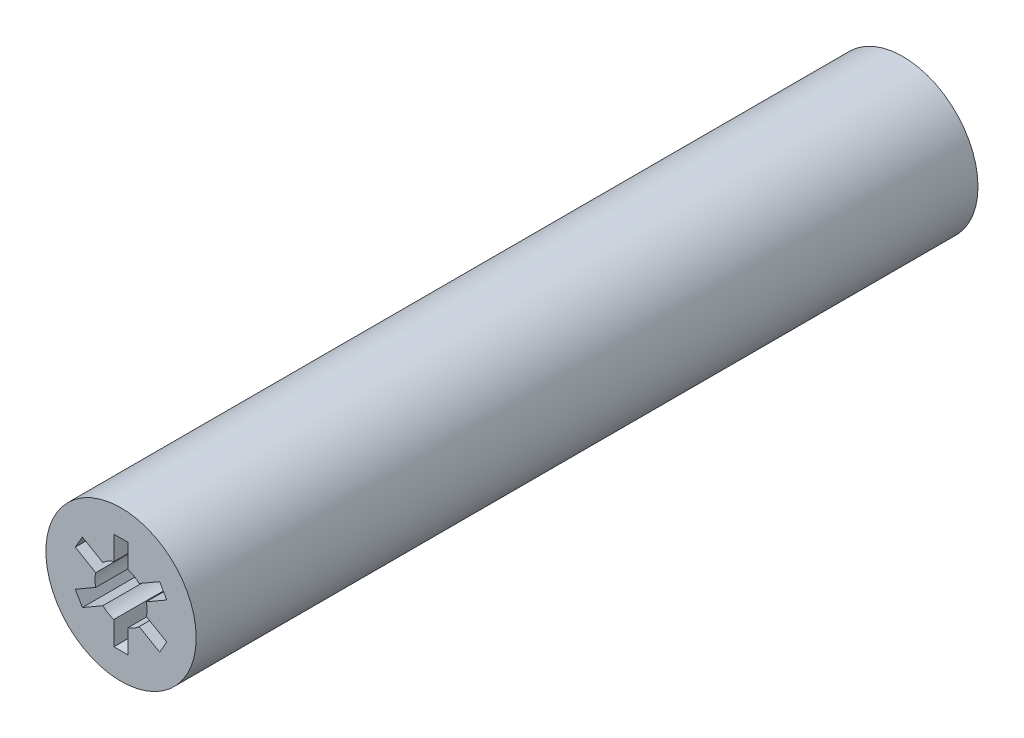
ISO-10303-21;
HEADER;
FILE_DESCRIPTION(('STEP AP214'),'2;1');
FILE_NAME('part.step','',(''),(''),'','','');
FILE_SCHEMA(('AUTOMOTIVE_DESIGN { 1 0 10303 214 1 1 1 1 }'));
ENDSEC;
DATA;
#1=APPLICATION_CONTEXT('core data for automotive mechanical design processes');
#2=APPLICATION_PROTOCOL_DEFINITION('international standard','automotive_design',2000,#1);
#3=PRODUCT_CONTEXT('',#1,'mechanical');
#4=PRODUCT('Part','Part','',(#3));
#5=PRODUCT_RELATED_PRODUCT_CATEGORY('part','',(#4));
#6=PRODUCT_DEFINITION_FORMATION('','',#4);
#7=PRODUCT_DEFINITION_CONTEXT('part definition',#1,'design');
#8=PRODUCT_DEFINITION('design','',#6,#7);
#9=PRODUCT_DEFINITION_SHAPE('','',#8);
#10=(LENGTH_UNIT() NAMED_UNIT(*) SI_UNIT(.MILLI.,.METRE.));
#11=(NAMED_UNIT(*) PLANE_ANGLE_UNIT() SI_UNIT($,.RADIAN.));
#12=(NAMED_UNIT(*) SI_UNIT($,.STERADIAN.) SOLID_ANGLE_UNIT());
#13=UNCERTAINTY_MEASURE_WITH_UNIT(LENGTH_MEASURE(1.E-05),#10,'distance_accuracy_value','');
#14=(GEOMETRIC_REPRESENTATION_CONTEXT(3) GLOBAL_UNCERTAINTY_ASSIGNED_CONTEXT((#13)) GLOBAL_UNIT_ASSIGNED_CONTEXT((#10,
#11,#12)) REPRESENTATION_CONTEXT('',''));
#15=CARTESIAN_POINT('',(0.,0.,0.));
#16=DIRECTION('',(0.,0.,1.));
#17=DIRECTION('',(1.,0.,0.));
#18=AXIS2_PLACEMENT_3D('',#15,#16,#17);
#19=CARTESIAN_POINT('',(0.,0.,82.55));
#20=DIRECTION('',(0.,0.,1.));
#21=DIRECTION('',(1.,0.,0.));
#22=AXIS2_PLACEMENT_3D('',#19,#20,#21);
#23=PLANE('',#22);
#24=CARTESIAN_POINT('',(0.,0.,82.55));
#25=DIRECTION('',(0.,0.,1.));
#26=DIRECTION('',(1.,0.,0.));
#27=AXIS2_PLACEMENT_3D('',#24,#25,#26);
#28=CIRCLE('',#27,15.875);
#29=CARTESIAN_POINT('',(15.875,0.,82.55));
#30=VERTEX_POINT('',#29);
#31=EDGE_CURVE('E11',#30,#30,#28,.T.);
#32=ORIENTED_EDGE('',*,*,#31,.T.);
#33=EDGE_LOOP('',(#32));
#34=FACE_BOUND('',#33,.T.);
#35=DIRECTION('',(-1.,0.,0.));
#36=VECTOR('',#35,1.);
#37=CARTESIAN_POINT('',(-1.5,10.2915026221292,82.55));
#38=LINE('',#37,#36);
#39=CARTESIAN_POINT('',(1.5,10.2915026221292,82.55));
#40=VERTEX_POINT('',#39);
#41=CARTESIAN_POINT('',(-1.5,10.2915026221292,82.55));
#42=VERTEX_POINT('',#41);
#43=EDGE_CURVE('E216',#40,#42,#38,.T.);
#44=ORIENTED_EDGE('',*,*,#43,.F.);
#45=DIRECTION('',(0.,1.,0.));
#46=VECTOR('',#45,1.);
#47=CARTESIAN_POINT('',(1.5,10.2915026221292,82.55));
#48=LINE('',#47,#46);
#49=CARTESIAN_POINT('',(1.5,5.29150262212918,82.55));
#50=VERTEX_POINT('',#49);
#51=EDGE_CURVE('E207',#50,#40,#48,.T.);
#52=ORIENTED_EDGE('',*,*,#51,.F.);
#53=CARTESIAN_POINT('',(0.,0.,82.55));
#54=DIRECTION('',(0.,0.,1.));
#55=DIRECTION('',(1.,0.,0.));
#56=AXIS2_PLACEMENT_3D('',#53,#54,#55);
#57=CIRCLE('',#56,5.5);
#58=CARTESIAN_POINT('',(3.83257569495584,3.94478941674125,82.55));
#59=VERTEX_POINT('',#58);
#60=EDGE_CURVE('E295',#59,#50,#57,.T.);
#61=ORIENTED_EDGE('',*,*,#60,.F.);
#62=DIRECTION('',(-0.866025403784439,-0.5,0.));
#63=VECTOR('',#62,1.);
#64=CARTESIAN_POINT('',(3.83257569495584,3.94478941674125,82.55));
#65=LINE('',#64,#63);
#66=CARTESIAN_POINT('',(8.16270271387803,6.44478941674125,82.55));
#67=VERTEX_POINT('',#66);
#68=EDGE_CURVE('E292',#67,#59,#65,.T.);
#69=ORIENTED_EDGE('',*,*,#68,.F.);
#70=DIRECTION('',(-0.500000000000001,0.866025403784438,0.));
#71=VECTOR('',#70,1.);
#72=CARTESIAN_POINT('',(8.16270271387803,6.44478941674125,82.55));
#73=LINE('',#72,#71);
#74=CARTESIAN_POINT('',(9.66270271387804,3.84671320538793,82.55));
#75=VERTEX_POINT('',#74);
#76=EDGE_CURVE('E289',#75,#67,#73,.T.);
#77=ORIENTED_EDGE('',*,*,#76,.F.);
#78=DIRECTION('',(0.866025403784438,0.5,0.));
#79=VECTOR('',#78,1.);
#80=CARTESIAN_POINT('',(9.66270271387804,3.84671320538793,82.55));
#81=LINE('',#80,#79);
#82=CARTESIAN_POINT('',(5.33257569495584,1.34671320538793,82.55));
#83=VERTEX_POINT('',#82);
#84=EDGE_CURVE('E286',#83,#75,#81,.T.);
#85=ORIENTED_EDGE('',*,*,#84,.F.);
#86=CARTESIAN_POINT('',(0.,0.,82.55));
#87=DIRECTION('',(0.,0.,1.));
#88=DIRECTION('',(1.,0.,0.));
#89=AXIS2_PLACEMENT_3D('',#86,#87,#88);
#90=CIRCLE('',#89,5.5);
#91=CARTESIAN_POINT('',(5.33257569495584,-1.34671320538793,82.55));
#92=VERTEX_POINT('',#91);
#93=EDGE_CURVE('E283',#92,#83,#90,.T.);
#94=ORIENTED_EDGE('',*,*,#93,.F.);
#95=DIRECTION('',(-0.866025403784439,0.5,0.));
#96=VECTOR('',#95,1.);
#97=CARTESIAN_POINT('',(5.33257569495584,-1.34671320538793,82.55));
#98=LINE('',#97,#96);
#99=CARTESIAN_POINT('',(9.66270271387804,-3.84671320538793,82.55));
#100=VERTEX_POINT('',#99);
#101=EDGE_CURVE('E280',#100,#92,#98,.T.);
#102=ORIENTED_EDGE('',*,*,#101,.F.);
#103=DIRECTION('',(0.499999999999999,0.866025403784439,0.));
#104=VECTOR('',#103,1.);
#105=CARTESIAN_POINT('',(9.66270271387804,-3.84671320538793,82.55));
#106=LINE('',#105,#104);
#107=CARTESIAN_POINT('',(8.16270271387804,-6.44478941674125,82.55));
#108=VERTEX_POINT('',#107);
#109=EDGE_CURVE('E277',#108,#100,#106,.T.);
#110=ORIENTED_EDGE('',*,*,#109,.F.);
#111=DIRECTION('',(0.866025403784439,-0.5,0.));
#112=VECTOR('',#111,1.);
#113=CARTESIAN_POINT('',(8.16270271387804,-6.44478941674125,82.55));
#114=LINE('',#113,#112);
#115=CARTESIAN_POINT('',(3.83257569495584,-3.94478941674125,82.55));
#116=VERTEX_POINT('',#115);
#117=EDGE_CURVE('E274',#116,#108,#114,.T.);
#118=ORIENTED_EDGE('',*,*,#117,.F.);
#119=CARTESIAN_POINT('',(0.,0.,82.55));
#120=DIRECTION('',(0.,0.,1.));
#121=DIRECTION('',(1.,0.,0.));
#122=AXIS2_PLACEMENT_3D('',#119,#120,#121);
#123=CIRCLE('',#122,5.5);
#124=CARTESIAN_POINT('',(1.5,-5.29150262212918,82.55));
#125=VERTEX_POINT('',#124);
#126=EDGE_CURVE('E271',#125,#116,#123,.T.);
#127=ORIENTED_EDGE('',*,*,#126,.F.);
#128=DIRECTION('',(0.,1.,0.));
#129=VECTOR('',#128,1.);
#130=CARTESIAN_POINT('',(1.5,-5.29150262212918,82.55));
#131=LINE('',#130,#129);
#132=CARTESIAN_POINT('',(1.5,-10.2915026221292,82.55));
#133=VERTEX_POINT('',#132);
#134=EDGE_CURVE('E268',#133,#125,#131,.T.);
#135=ORIENTED_EDGE('',*,*,#134,.F.);
#136=DIRECTION('',(1.,0.,0.));
#137=VECTOR('',#136,1.);
#138=CARTESIAN_POINT('',(1.5,-10.2915026221292,82.55));
#139=LINE('',#138,#137);
#140=CARTESIAN_POINT('',(-1.5,-10.2915026221292,82.55));
#141=VERTEX_POINT('',#140);
#142=EDGE_CURVE('E265',#141,#133,#139,.T.);
#143=ORIENTED_EDGE('',*,*,#142,.F.);
#144=DIRECTION('',(0.,-1.,0.));
#145=VECTOR('',#144,1.);
#146=CARTESIAN_POINT('',(-1.5,-10.2915026221292,82.55));
#147=LINE('',#146,#145);
#148=CARTESIAN_POINT('',(-1.5,-5.29150262212918,82.55));
#149=VERTEX_POINT('',#148);
#150=EDGE_CURVE('E262',#149,#141,#147,.T.);
#151=ORIENTED_EDGE('',*,*,#150,.F.);
#152=CARTESIAN_POINT('',(0.,0.,82.55));
#153=DIRECTION('',(0.,0.,1.));
#154=DIRECTION('',(1.,0.,0.));
#155=AXIS2_PLACEMENT_3D('',#152,#153,#154);
#156=CIRCLE('',#155,5.5);
#157=CARTESIAN_POINT('',(-3.83257569495584,-3.94478941674125,82.55));
#158=VERTEX_POINT('',#157);
#159=EDGE_CURVE('E259',#158,#149,#156,.T.);
#160=ORIENTED_EDGE('',*,*,#159,.F.);
#161=DIRECTION('',(0.866025403784438,0.5,0.));
#162=VECTOR('',#161,1.);
#163=CARTESIAN_POINT('',(-3.83257569495584,-3.94478941674125,82.55));
#164=LINE('',#163,#162);
#165=CARTESIAN_POINT('',(-8.16270271387803,-6.44478941674125,82.55));
#166=VERTEX_POINT('',#165);
#167=EDGE_CURVE('E256',#166,#158,#164,.T.);
#168=ORIENTED_EDGE('',*,*,#167,.F.);
#169=DIRECTION('',(0.500000000000001,-0.866025403784438,0.));
#170=VECTOR('',#169,1.);
#171=CARTESIAN_POINT('',(-8.16270271387803,-6.44478941674125,82.55));
#172=LINE('',#171,#170);
#173=CARTESIAN_POINT('',(-9.66270271387803,-3.84671320538794,82.55));
#174=VERTEX_POINT('',#173);
#175=EDGE_CURVE('E253',#174,#166,#172,.T.);
#176=ORIENTED_EDGE('',*,*,#175,.F.);
#177=DIRECTION('',(-0.866025403784438,-0.500000000000001,0.));
#178=VECTOR('',#177,1.);
#179=CARTESIAN_POINT('',(-9.66270271387803,-3.84671320538794,82.55));
#180=LINE('',#179,#178);
#181=CARTESIAN_POINT('',(-5.33257569495584,-1.34671320538793,82.55));
#182=VERTEX_POINT('',#181);
#183=EDGE_CURVE('E250',#182,#174,#180,.T.);
#184=ORIENTED_EDGE('',*,*,#183,.F.);
#185=CARTESIAN_POINT('',(0.,0.,82.55));
#186=DIRECTION('',(0.,0.,1.));
#187=DIRECTION('',(1.,0.,0.));
#188=AXIS2_PLACEMENT_3D('',#185,#186,#187);
#189=CIRCLE('',#188,5.5);
#190=CARTESIAN_POINT('',(-5.33257569495584,1.34671320538793,82.55));
#191=VERTEX_POINT('',#190);
#192=EDGE_CURVE('E247',#191,#182,#189,.T.);
#193=ORIENTED_EDGE('',*,*,#192,.F.);
#194=DIRECTION('',(0.866025403784439,-0.5,0.));
#195=VECTOR('',#194,1.);
#196=CARTESIAN_POINT('',(-5.33257569495584,1.34671320538793,82.55));
#197=LINE('',#196,#195);
#198=CARTESIAN_POINT('',(-9.66270271387804,3.84671320538793,82.55));
#199=VERTEX_POINT('',#198);
#200=EDGE_CURVE('E244',#199,#191,#197,.T.);
#201=ORIENTED_EDGE('',*,*,#200,.F.);
#202=DIRECTION('',(-0.499999999999999,-0.866025403784439,0.));
#203=VECTOR('',#202,1.);
#204=CARTESIAN_POINT('',(-9.66270271387804,3.84671320538793,82.55));
#205=LINE('',#204,#203);
#206=CARTESIAN_POINT('',(-8.16270271387804,6.44478941674124,82.55));
#207=VERTEX_POINT('',#206);
#208=EDGE_CURVE('E241',#207,#199,#205,.T.);
#209=ORIENTED_EDGE('',*,*,#208,.F.);
#210=DIRECTION('',(-0.866025403784439,0.499999999999999,0.));
#211=VECTOR('',#210,1.);
#212=CARTESIAN_POINT('',(-8.16270271387804,6.44478941674124,82.55));
#213=LINE('',#212,#211);
#214=CARTESIAN_POINT('',(-3.83257569495585,3.94478941674125,82.55));
#215=VERTEX_POINT('',#214);
#216=EDGE_CURVE('E238',#215,#207,#213,.T.);
#217=ORIENTED_EDGE('',*,*,#216,.F.);
#218=CARTESIAN_POINT('',(0.,0.,82.55));
#219=DIRECTION('',(0.,0.,1.));
#220=DIRECTION('',(1.,0.,0.));
#221=AXIS2_PLACEMENT_3D('',#218,#219,#220);
#222=CIRCLE('',#221,5.5);
#223=CARTESIAN_POINT('',(-1.5,5.29150262212918,82.55));
#224=VERTEX_POINT('',#223);
#225=EDGE_CURVE('E233',#224,#215,#222,.T.);
#226=ORIENTED_EDGE('',*,*,#225,.F.);
#227=DIRECTION('',(0.,-1.,0.));
#228=VECTOR('',#227,1.);
#229=CARTESIAN_POINT('',(-1.5,5.29150262212918,82.55));
#230=LINE('',#229,#228);
#231=EDGE_CURVE('E229',#42,#224,#230,.T.);
#232=ORIENTED_EDGE('',*,*,#231,.F.);
#233=EDGE_LOOP('',(#44,#52,#61,#69,#77,#85,#94,#102,#110,#118,#127,#135,#143,#151,#160,#168,
#176,#184,#193,#201,#209,#217,#226,#232));
#234=FACE_BOUND('',#233,.T.);
#235=ADVANCED_FACE('F45',(#34,#234),#23,.T.);
#236=CARTESIAN_POINT('',(0.,0.,-82.55));
#237=DIRECTION('',(0.,0.,1.));
#238=DIRECTION('',(1.,0.,0.));
#239=AXIS2_PLACEMENT_3D('',#236,#237,#238);
#240=PLANE('',#239);
#241=CARTESIAN_POINT('',(0.,0.,-82.55));
#242=DIRECTION('',(0.,0.,1.));
#243=DIRECTION('',(1.,0.,0.));
#244=AXIS2_PLACEMENT_3D('',#241,#242,#243);
#245=CIRCLE('',#244,15.875);
#246=CARTESIAN_POINT('',(15.875,0.,-82.55));
#247=VERTEX_POINT('',#246);
#248=EDGE_CURVE('E49',#247,#247,#245,.T.);
#249=ORIENTED_EDGE('',*,*,#248,.F.);
#250=EDGE_LOOP('',(#249));
#251=FACE_BOUND('',#250,.T.);
#252=DIRECTION('',(0.,1.,0.));
#253=VECTOR('',#252,1.);
#254=CARTESIAN_POINT('',(1.5,10.2915026221292,-82.55));
#255=LINE('',#254,#253);
#256=CARTESIAN_POINT('',(1.5,5.29150262212918,-82.55));
#257=VERTEX_POINT('',#256);
#258=CARTESIAN_POINT('',(1.5,10.2915026221292,-82.55));
#259=VERTEX_POINT('',#258);
#260=EDGE_CURVE('E69',#257,#259,#255,.T.);
#261=ORIENTED_EDGE('',*,*,#260,.T.);
#262=DIRECTION('',(-1.,0.,0.));
#263=VECTOR('',#262,1.);
#264=CARTESIAN_POINT('',(-1.5,10.2915026221292,-82.55));
#265=LINE('',#264,#263);
#266=CARTESIAN_POINT('',(-1.5,10.2915026221292,-82.55));
#267=VERTEX_POINT('',#266);
#268=EDGE_CURVE('E223',#259,#267,#265,.T.);
#269=ORIENTED_EDGE('',*,*,#268,.T.);
#270=DIRECTION('',(0.,-1.,0.));
#271=VECTOR('',#270,1.);
#272=CARTESIAN_POINT('',(-1.5,5.29150262212918,-82.55));
#273=LINE('',#272,#271);
#274=CARTESIAN_POINT('',(-1.5,5.29150262212918,-82.55));
#275=VERTEX_POINT('',#274);
#276=EDGE_CURVE('E302',#267,#275,#273,.T.);
#277=ORIENTED_EDGE('',*,*,#276,.T.);
#278=CARTESIAN_POINT('',(0.,0.,-82.55));
#279=DIRECTION('',(0.,0.,1.));
#280=DIRECTION('',(1.,0.,0.));
#281=AXIS2_PLACEMENT_3D('',#278,#279,#280);
#282=CIRCLE('',#281,5.5);
#283=CARTESIAN_POINT('',(-3.83257569495585,3.94478941674125,-82.55));
#284=VERTEX_POINT('',#283);
#285=EDGE_CURVE('E306',#275,#284,#282,.T.);
#286=ORIENTED_EDGE('',*,*,#285,.T.);
#287=DIRECTION('',(-0.866025403784439,0.499999999999999,0.));
#288=VECTOR('',#287,1.);
#289=CARTESIAN_POINT('',(-8.16270271387804,6.44478941674124,-82.55));
#290=LINE('',#289,#288);
#291=CARTESIAN_POINT('',(-8.16270271387804,6.44478941674124,-82.55));
#292=VERTEX_POINT('',#291);
#293=EDGE_CURVE('E310',#284,#292,#290,.T.);
#294=ORIENTED_EDGE('',*,*,#293,.T.);
#295=DIRECTION('',(-0.499999999999999,-0.866025403784439,0.));
#296=VECTOR('',#295,1.);
#297=CARTESIAN_POINT('',(-9.66270271387804,3.84671320538793,-82.55));
#298=LINE('',#297,#296);
#299=CARTESIAN_POINT('',(-9.66270271387804,3.84671320538793,-82.55));
#300=VERTEX_POINT('',#299);
#301=EDGE_CURVE('E314',#292,#300,#298,.T.);
#302=ORIENTED_EDGE('',*,*,#301,.T.);
#303=DIRECTION('',(0.866025403784439,-0.5,0.));
#304=VECTOR('',#303,1.);
#305=CARTESIAN_POINT('',(-5.33257569495584,1.34671320538793,-82.55));
#306=LINE('',#305,#304);
#307=CARTESIAN_POINT('',(-5.33257569495584,1.34671320538793,-82.55));
#308=VERTEX_POINT('',#307);
#309=EDGE_CURVE('E318',#300,#308,#306,.T.);
#310=ORIENTED_EDGE('',*,*,#309,.T.);
#311=CARTESIAN_POINT('',(0.,0.,-82.55));
#312=DIRECTION('',(0.,0.,1.));
#313=DIRECTION('',(1.,0.,0.));
#314=AXIS2_PLACEMENT_3D('',#311,#312,#313);
#315=CIRCLE('',#314,5.5);
#316=CARTESIAN_POINT('',(-5.33257569495584,-1.34671320538793,-82.55));
#317=VERTEX_POINT('',#316);
#318=EDGE_CURVE('E322',#308,#317,#315,.T.);
#319=ORIENTED_EDGE('',*,*,#318,.T.);
#320=DIRECTION('',(-0.866025403784438,-0.500000000000001,0.));
#321=VECTOR('',#320,1.);
#322=CARTESIAN_POINT('',(-9.66270271387803,-3.84671320538794,-82.55));
#323=LINE('',#322,#321);
#324=CARTESIAN_POINT('',(-9.66270271387803,-3.84671320538794,-82.55));
#325=VERTEX_POINT('',#324);
#326=EDGE_CURVE('E326',#317,#325,#323,.T.);
#327=ORIENTED_EDGE('',*,*,#326,.T.);
#328=DIRECTION('',(0.500000000000001,-0.866025403784438,0.));
#329=VECTOR('',#328,1.);
#330=CARTESIAN_POINT('',(-8.16270271387803,-6.44478941674125,-82.55));
#331=LINE('',#330,#329);
#332=CARTESIAN_POINT('',(-8.16270271387803,-6.44478941674125,-82.55));
#333=VERTEX_POINT('',#332);
#334=EDGE_CURVE('E330',#325,#333,#331,.T.);
#335=ORIENTED_EDGE('',*,*,#334,.T.);
#336=DIRECTION('',(0.866025403784438,0.5,0.));
#337=VECTOR('',#336,1.);
#338=CARTESIAN_POINT('',(-3.83257569495584,-3.94478941674125,-82.55));
#339=LINE('',#338,#337);
#340=CARTESIAN_POINT('',(-3.83257569495584,-3.94478941674125,-82.55));
#341=VERTEX_POINT('',#340);
#342=EDGE_CURVE('E334',#333,#341,#339,.T.);
#343=ORIENTED_EDGE('',*,*,#342,.T.);
#344=CARTESIAN_POINT('',(0.,0.,-82.55));
#345=DIRECTION('',(0.,0.,1.));
#346=DIRECTION('',(1.,0.,0.));
#347=AXIS2_PLACEMENT_3D('',#344,#345,#346);
#348=CIRCLE('',#347,5.5);
#349=CARTESIAN_POINT('',(-1.5,-5.29150262212918,-82.55));
#350=VERTEX_POINT('',#349);
#351=EDGE_CURVE('E338',#341,#350,#348,.T.);
#352=ORIENTED_EDGE('',*,*,#351,.T.);
#353=DIRECTION('',(0.,-1.,0.));
#354=VECTOR('',#353,1.);
#355=CARTESIAN_POINT('',(-1.5,-10.2915026221292,-82.55));
#356=LINE('',#355,#354);
#357=CARTESIAN_POINT('',(-1.5,-10.2915026221292,-82.55));
#358=VERTEX_POINT('',#357);
#359=EDGE_CURVE('E342',#350,#358,#356,.T.);
#360=ORIENTED_EDGE('',*,*,#359,.T.);
#361=DIRECTION('',(1.,0.,0.));
#362=VECTOR('',#361,1.);
#363=CARTESIAN_POINT('',(1.5,-10.2915026221292,-82.55));
#364=LINE('',#363,#362);
#365=CARTESIAN_POINT('',(1.5,-10.2915026221292,-82.55));
#366=VERTEX_POINT('',#365);
#367=EDGE_CURVE('E346',#358,#366,#364,.T.);
#368=ORIENTED_EDGE('',*,*,#367,.T.);
#369=DIRECTION('',(0.,1.,0.));
#370=VECTOR('',#369,1.);
#371=CARTESIAN_POINT('',(1.5,-5.29150262212918,-82.55));
#372=LINE('',#371,#370);
#373=CARTESIAN_POINT('',(1.5,-5.29150262212918,-82.55));
#374=VERTEX_POINT('',#373);
#375=EDGE_CURVE('E350',#366,#374,#372,.T.);
#376=ORIENTED_EDGE('',*,*,#375,.T.);
#377=CARTESIAN_POINT('',(0.,0.,-82.55));
#378=DIRECTION('',(0.,0.,1.));
#379=DIRECTION('',(1.,0.,0.));
#380=AXIS2_PLACEMENT_3D('',#377,#378,#379);
#381=CIRCLE('',#380,5.5);
#382=CARTESIAN_POINT('',(3.83257569495584,-3.94478941674125,-82.55));
#383=VERTEX_POINT('',#382);
#384=EDGE_CURVE('E354',#374,#383,#381,.T.);
#385=ORIENTED_EDGE('',*,*,#384,.T.);
#386=DIRECTION('',(0.866025403784439,-0.5,0.));
#387=VECTOR('',#386,1.);
#388=CARTESIAN_POINT('',(8.16270271387804,-6.44478941674125,-82.55));
#389=LINE('',#388,#387);
#390=CARTESIAN_POINT('',(8.16270271387804,-6.44478941674125,-82.55));
#391=VERTEX_POINT('',#390);
#392=EDGE_CURVE('E358',#383,#391,#389,.T.);
#393=ORIENTED_EDGE('',*,*,#392,.T.);
#394=DIRECTION('',(0.499999999999999,0.866025403784439,0.));
#395=VECTOR('',#394,1.);
#396=CARTESIAN_POINT('',(9.66270271387804,-3.84671320538793,-82.55));
#397=LINE('',#396,#395);
#398=CARTESIAN_POINT('',(9.66270271387804,-3.84671320538793,-82.55));
#399=VERTEX_POINT('',#398);
#400=EDGE_CURVE('E362',#391,#399,#397,.T.);
#401=ORIENTED_EDGE('',*,*,#400,.T.);
#402=DIRECTION('',(-0.866025403784439,0.5,0.));
#403=VECTOR('',#402,1.);
#404=CARTESIAN_POINT('',(5.33257569495584,-1.34671320538793,-82.55));
#405=LINE('',#404,#403);
#406=CARTESIAN_POINT('',(5.33257569495584,-1.34671320538793,-82.55));
#407=VERTEX_POINT('',#406);
#408=EDGE_CURVE('E366',#399,#407,#405,.T.);
#409=ORIENTED_EDGE('',*,*,#408,.T.);
#410=CARTESIAN_POINT('',(0.,0.,-82.55));
#411=DIRECTION('',(0.,0.,1.));
#412=DIRECTION('',(1.,0.,0.));
#413=AXIS2_PLACEMENT_3D('',#410,#411,#412);
#414=CIRCLE('',#413,5.5);
#415=CARTESIAN_POINT('',(5.33257569495584,1.34671320538793,-82.55));
#416=VERTEX_POINT('',#415);
#417=EDGE_CURVE('E370',#407,#416,#414,.T.);
#418=ORIENTED_EDGE('',*,*,#417,.T.);
#419=DIRECTION('',(0.866025403784438,0.5,0.));
#420=VECTOR('',#419,1.);
#421=CARTESIAN_POINT('',(9.66270271387804,3.84671320538793,-82.55));
#422=LINE('',#421,#420);
#423=CARTESIAN_POINT('',(9.66270271387804,3.84671320538793,-82.55));
#424=VERTEX_POINT('',#423);
#425=EDGE_CURVE('E374',#416,#424,#422,.T.);
#426=ORIENTED_EDGE('',*,*,#425,.T.);
#427=DIRECTION('',(-0.500000000000001,0.866025403784438,0.));
#428=VECTOR('',#427,1.);
#429=CARTESIAN_POINT('',(8.16270271387803,6.44478941674125,-82.55));
#430=LINE('',#429,#428);
#431=CARTESIAN_POINT('',(8.16270271387803,6.44478941674125,-82.55));
#432=VERTEX_POINT('',#431);
#433=EDGE_CURVE('E378',#424,#432,#430,.T.);
#434=ORIENTED_EDGE('',*,*,#433,.T.);
#435=DIRECTION('',(-0.866025403784439,-0.5,0.));
#436=VECTOR('',#435,1.);
#437=CARTESIAN_POINT('',(3.83257569495584,3.94478941674125,-82.55));
#438=LINE('',#437,#436);
#439=CARTESIAN_POINT('',(3.83257569495584,3.94478941674125,-82.55));
#440=VERTEX_POINT('',#439);
#441=EDGE_CURVE('E382',#432,#440,#438,.T.);
#442=ORIENTED_EDGE('',*,*,#441,.T.);
#443=CARTESIAN_POINT('',(0.,0.,-82.55));
#444=DIRECTION('',(0.,0.,1.));
#445=DIRECTION('',(1.,0.,0.));
#446=AXIS2_PLACEMENT_3D('',#443,#444,#445);
#447=CIRCLE('',#446,5.5);
#448=EDGE_CURVE('E217',#440,#257,#447,.T.);
#449=ORIENTED_EDGE('',*,*,#448,.T.);
#450=EDGE_LOOP('',(#261,#269,#277,#286,#294,#302,#310,#319,#327,#335,#343,#352,#360,#368,#376,
#385,#393,#401,#409,#418,#426,#434,#442,#449));
#451=FACE_BOUND('',#450,.T.);
#452=ADVANCED_FACE('F460',(#251,#451),#240,.F.);
#453=CARTESIAN_POINT('',(0.,0.,82.55));
#454=DIRECTION('',(0.,0.,-1.));
#455=DIRECTION('',(-1.,0.,0.));
#456=AXIS2_PLACEMENT_3D('',#453,#454,#455);
#457=CYLINDRICAL_SURFACE('',#456,15.875);
#458=ORIENTED_EDGE('',*,*,#31,.F.);
#459=EDGE_LOOP('',(#458));
#460=FACE_BOUND('',#459,.T.);
#461=ORIENTED_EDGE('',*,*,#248,.T.);
#462=EDGE_LOOP('',(#461));
#463=FACE_BOUND('',#462,.T.);
#464=ADVANCED_FACE('F47',(#460,#463),#457,.T.);
#465=CARTESIAN_POINT('',(1.5,10.2915026221292,82.55));
#466=DIRECTION('',(-1.,0.,0.));
#467=DIRECTION('',(0.,-1.,0.));
#468=AXIS2_PLACEMENT_3D('',#465,#466,#467);
#469=PLANE('',#468);
#470=ORIENTED_EDGE('',*,*,#260,.F.);
#471=DIRECTION('',(0.,0.,-1.));
#472=VECTOR('',#471,1.);
#473=CARTESIAN_POINT('',(1.5,5.29150262212918,82.55));
#474=LINE('',#473,#472);
#475=EDGE_CURVE('E211',#50,#257,#474,.T.);
#476=ORIENTED_EDGE('',*,*,#475,.F.);
#477=ORIENTED_EDGE('',*,*,#51,.T.);
#478=DIRECTION('',(0.,0.,-1.));
#479=VECTOR('',#478,1.);
#480=CARTESIAN_POINT('',(1.5,10.2915026221292,82.55));
#481=LINE('',#480,#479);
#482=EDGE_CURVE('E210',#40,#259,#481,.T.);
#483=ORIENTED_EDGE('',*,*,#482,.T.);
#484=EDGE_LOOP('',(#470,#476,#477,#483));
#485=FACE_BOUND('',#484,.T.);
#486=ADVANCED_FACE('F209',(#485),#469,.T.);
#487=CARTESIAN_POINT('',(-1.5,10.2915026221292,82.55));
#488=DIRECTION('',(0.,-1.,0.));
#489=DIRECTION('',(0.,0.,-1.));
#490=AXIS2_PLACEMENT_3D('',#487,#488,#489);
#491=PLANE('',#490);
#492=ORIENTED_EDGE('',*,*,#268,.F.);
#493=ORIENTED_EDGE('',*,*,#482,.F.);
#494=ORIENTED_EDGE('',*,*,#43,.T.);
#495=DIRECTION('',(0.,0.,-1.));
#496=VECTOR('',#495,1.);
#497=CARTESIAN_POINT('',(-1.5,10.2915026221292,82.55));
#498=LINE('',#497,#496);
#499=EDGE_CURVE('E225',#42,#267,#498,.T.);
#500=ORIENTED_EDGE('',*,*,#499,.T.);
#501=EDGE_LOOP('',(#492,#493,#494,#500));
#502=FACE_BOUND('',#501,.T.);
#503=ADVANCED_FACE('F220',(#502),#491,.T.);
#504=CARTESIAN_POINT('',(-1.5,5.29150262212918,82.55));
#505=DIRECTION('',(1.,0.,0.));
#506=DIRECTION('',(0.,1.,0.));
#507=AXIS2_PLACEMENT_3D('',#504,#505,#506);
#508=PLANE('',#507);
#509=ORIENTED_EDGE('',*,*,#276,.F.);
#510=ORIENTED_EDGE('',*,*,#499,.F.);
#511=ORIENTED_EDGE('',*,*,#231,.T.);
#512=DIRECTION('',(0.,0.,-1.));
#513=VECTOR('',#512,1.);
#514=CARTESIAN_POINT('',(-1.5,5.29150262212918,82.55));
#515=LINE('',#514,#513);
#516=EDGE_CURVE('E450',#224,#275,#515,.T.);
#517=ORIENTED_EDGE('',*,*,#516,.T.);
#518=EDGE_LOOP('',(#509,#510,#511,#517));
#519=FACE_BOUND('',#518,.T.);
#520=ADVANCED_FACE('F456',(#519),#508,.T.);
#521=CARTESIAN_POINT('',(0.,0.,82.55));
#522=DIRECTION('',(0.,0.,-1.));
#523=DIRECTION('',(-1.,0.,0.));
#524=AXIS2_PLACEMENT_3D('',#521,#522,#523);
#525=CYLINDRICAL_SURFACE('',#524,5.5);
#526=ORIENTED_EDGE('',*,*,#285,.F.);
#527=ORIENTED_EDGE('',*,*,#516,.F.);
#528=ORIENTED_EDGE('',*,*,#225,.T.);
#529=DIRECTION('',(0.,0.,-1.));
#530=VECTOR('',#529,1.);
#531=CARTESIAN_POINT('',(-3.83257569495585,3.94478941674125,82.55));
#532=LINE('',#531,#530);
#533=EDGE_CURVE('E447',#215,#284,#532,.T.);
#534=ORIENTED_EDGE('',*,*,#533,.T.);
#535=EDGE_LOOP('',(#526,#527,#528,#534));
#536=FACE_BOUND('',#535,.T.);
#537=ADVANCED_FACE('F558',(#536),#525,.F.);
#538=CARTESIAN_POINT('',(-8.16270271387804,6.44478941674124,82.55));
#539=DIRECTION('',(-0.499999999999999,-0.866025403784439,0.));
#540=DIRECTION('',(0.866025403784439,-0.499999999999999,0.));
#541=AXIS2_PLACEMENT_3D('',#538,#539,#540);
#542=PLANE('',#541);
#543=ORIENTED_EDGE('',*,*,#293,.F.);
#544=ORIENTED_EDGE('',*,*,#533,.F.);
#545=ORIENTED_EDGE('',*,*,#216,.T.);
#546=DIRECTION('',(0.,0.,-1.));
#547=VECTOR('',#546,1.);
#548=CARTESIAN_POINT('',(-8.16270271387804,6.44478941674124,82.55));
#549=LINE('',#548,#547);
#550=EDGE_CURVE('E444',#207,#292,#549,.T.);
#551=ORIENTED_EDGE('',*,*,#550,.T.);
#552=EDGE_LOOP('',(#543,#544,#545,#551));
#553=FACE_BOUND('',#552,.T.);
#554=ADVANCED_FACE('F556',(#553),#542,.T.);
#555=CARTESIAN_POINT('',(-9.66270271387804,3.84671320538793,82.55));
#556=DIRECTION('',(0.866025403784439,-0.499999999999999,0.));
#557=DIRECTION('',(0.499999999999999,0.866025403784439,0.));
#558=AXIS2_PLACEMENT_3D('',#555,#556,#557);
#559=PLANE('',#558);
#560=ORIENTED_EDGE('',*,*,#301,.F.);
#561=ORIENTED_EDGE('',*,*,#550,.F.);
#562=ORIENTED_EDGE('',*,*,#208,.T.);
#563=DIRECTION('',(0.,0.,-1.));
#564=VECTOR('',#563,1.);
#565=CARTESIAN_POINT('',(-9.66270271387804,3.84671320538793,82.55));
#566=LINE('',#565,#564);
#567=EDGE_CURVE('E441',#199,#300,#566,.T.);
#568=ORIENTED_EDGE('',*,*,#567,.T.);
#569=EDGE_LOOP('',(#560,#561,#562,#568));
#570=FACE_BOUND('',#569,.T.);
#571=ADVANCED_FACE('F550',(#570),#559,.T.);
#572=CARTESIAN_POINT('',(-5.33257569495584,1.34671320538793,82.55));
#573=DIRECTION('',(0.5,0.866025403784439,0.));
#574=DIRECTION('',(-0.866025403784439,0.5,0.));
#575=AXIS2_PLACEMENT_3D('',#572,#573,#574);
#576=PLANE('',#575);
#577=ORIENTED_EDGE('',*,*,#309,.F.);
#578=ORIENTED_EDGE('',*,*,#567,.F.);
#579=ORIENTED_EDGE('',*,*,#200,.T.);
#580=DIRECTION('',(0.,0.,-1.));
#581=VECTOR('',#580,1.);
#582=CARTESIAN_POINT('',(-5.33257569495584,1.34671320538793,82.55));
#583=LINE('',#582,#581);
#584=EDGE_CURVE('E438',#191,#308,#583,.T.);
#585=ORIENTED_EDGE('',*,*,#584,.T.);
#586=EDGE_LOOP('',(#577,#578,#579,#585));
#587=FACE_BOUND('',#586,.T.);
#588=ADVANCED_FACE('F546',(#587),#576,.T.);
#589=CARTESIAN_POINT('',(0.,0.,82.55));
#590=DIRECTION('',(0.,0.,-1.));
#591=DIRECTION('',(-1.,0.,0.));
#592=AXIS2_PLACEMENT_3D('',#589,#590,#591);
#593=CYLINDRICAL_SURFACE('',#592,5.5);
#594=ORIENTED_EDGE('',*,*,#318,.F.);
#595=ORIENTED_EDGE('',*,*,#584,.F.);
#596=ORIENTED_EDGE('',*,*,#192,.T.);
#597=DIRECTION('',(0.,0.,-1.));
#598=VECTOR('',#597,1.);
#599=CARTESIAN_POINT('',(-5.33257569495584,-1.34671320538793,82.55));
#600=LINE('',#599,#598);
#601=EDGE_CURVE('E435',#182,#317,#600,.T.);
#602=ORIENTED_EDGE('',*,*,#601,.T.);
#603=EDGE_LOOP('',(#594,#595,#596,#602));
#604=FACE_BOUND('',#603,.T.);
#605=ADVANCED_FACE('F543',(#604),#593,.F.);
#606=CARTESIAN_POINT('',(-9.66270271387803,-3.84671320538794,82.55));
#607=DIRECTION('',(0.500000000000001,-0.866025403784438,0.));
#608=DIRECTION('',(0.866025403784438,0.500000000000001,0.));
#609=AXIS2_PLACEMENT_3D('',#606,#607,#608);
#610=PLANE('',#609);
#611=ORIENTED_EDGE('',*,*,#326,.F.);
#612=ORIENTED_EDGE('',*,*,#601,.F.);
#613=ORIENTED_EDGE('',*,*,#183,.T.);
#614=DIRECTION('',(0.,0.,-1.));
#615=VECTOR('',#614,1.);
#616=CARTESIAN_POINT('',(-9.66270271387803,-3.84671320538794,82.55));
#617=LINE('',#616,#615);
#618=EDGE_CURVE('E432',#174,#325,#617,.T.);
#619=ORIENTED_EDGE('',*,*,#618,.T.);
#620=EDGE_LOOP('',(#611,#612,#613,#619));
#621=FACE_BOUND('',#620,.T.);
#622=ADVANCED_FACE('F535',(#621),#610,.T.);
#623=CARTESIAN_POINT('',(-8.16270271387803,-6.44478941674125,82.55));
#624=DIRECTION('',(0.866025403784438,0.500000000000001,0.));
#625=DIRECTION('',(-0.500000000000001,0.866025403784438,0.));
#626=AXIS2_PLACEMENT_3D('',#623,#624,#625);
#627=PLANE('',#626);
#628=ORIENTED_EDGE('',*,*,#334,.F.);
#629=ORIENTED_EDGE('',*,*,#618,.F.);
#630=ORIENTED_EDGE('',*,*,#175,.T.);
#631=DIRECTION('',(0.,0.,-1.));
#632=VECTOR('',#631,1.);
#633=CARTESIAN_POINT('',(-8.16270271387803,-6.44478941674125,82.55));
#634=LINE('',#633,#632);
#635=EDGE_CURVE('E429',#166,#333,#634,.T.);
#636=ORIENTED_EDGE('',*,*,#635,.T.);
#637=EDGE_LOOP('',(#628,#629,#630,#636));
#638=FACE_BOUND('',#637,.T.);
#639=ADVANCED_FACE('F531',(#638),#627,.T.);
#640=CARTESIAN_POINT('',(-3.83257569495584,-3.94478941674125,82.55));
#641=DIRECTION('',(-0.5,0.866025403784438,0.));
#642=DIRECTION('',(-0.866025403784438,-0.500000000000001,0.));
#643=AXIS2_PLACEMENT_3D('',#640,#641,#642);
#644=PLANE('',#643);
#645=ORIENTED_EDGE('',*,*,#342,.F.);
#646=ORIENTED_EDGE('',*,*,#635,.F.);
#647=ORIENTED_EDGE('',*,*,#167,.T.);
#648=DIRECTION('',(0.,0.,-1.));
#649=VECTOR('',#648,1.);
#650=CARTESIAN_POINT('',(-3.83257569495584,-3.94478941674125,82.55));
#651=LINE('',#650,#649);
#652=EDGE_CURVE('E426',#158,#341,#651,.T.);
#653=ORIENTED_EDGE('',*,*,#652,.T.);
#654=EDGE_LOOP('',(#645,#646,#647,#653));
#655=FACE_BOUND('',#654,.T.);
#656=ADVANCED_FACE('F528',(#655),#644,.T.);
#657=CARTESIAN_POINT('',(0.,0.,82.55));
#658=DIRECTION('',(0.,0.,-1.));
#659=DIRECTION('',(-1.,0.,0.));
#660=AXIS2_PLACEMENT_3D('',#657,#658,#659);
#661=CYLINDRICAL_SURFACE('',#660,5.5);
#662=ORIENTED_EDGE('',*,*,#351,.F.);
#663=ORIENTED_EDGE('',*,*,#652,.F.);
#664=ORIENTED_EDGE('',*,*,#159,.T.);
#665=DIRECTION('',(0.,0.,-1.));
#666=VECTOR('',#665,1.);
#667=CARTESIAN_POINT('',(-1.5,-5.29150262212918,82.55));
#668=LINE('',#667,#666);
#669=EDGE_CURVE('E423',#149,#350,#668,.T.);
#670=ORIENTED_EDGE('',*,*,#669,.T.);
#671=EDGE_LOOP('',(#662,#663,#664,#670));
#672=FACE_BOUND('',#671,.T.);
#673=ADVANCED_FACE('F520',(#672),#661,.F.);
#674=CARTESIAN_POINT('',(-1.5,-10.2915026221292,82.55));
#675=DIRECTION('',(1.,0.,0.));
#676=DIRECTION('',(0.,1.,0.));
#677=AXIS2_PLACEMENT_3D('',#674,#675,#676);
#678=PLANE('',#677);
#679=ORIENTED_EDGE('',*,*,#359,.F.);
#680=ORIENTED_EDGE('',*,*,#669,.F.);
#681=ORIENTED_EDGE('',*,*,#150,.T.);
#682=DIRECTION('',(0.,0.,-1.));
#683=VECTOR('',#682,1.);
#684=CARTESIAN_POINT('',(-1.5,-10.2915026221292,82.55));
#685=LINE('',#684,#683);
#686=EDGE_CURVE('E420',#141,#358,#685,.T.);
#687=ORIENTED_EDGE('',*,*,#686,.T.);
#688=EDGE_LOOP('',(#679,#680,#681,#687));
#689=FACE_BOUND('',#688,.T.);
#690=ADVANCED_FACE('F516',(#689),#678,.T.);
#691=CARTESIAN_POINT('',(1.5,-10.2915026221292,82.55));
#692=DIRECTION('',(0.,1.,0.));
#693=DIRECTION('',(0.,0.,1.));
#694=AXIS2_PLACEMENT_3D('',#691,#692,#693);
#695=PLANE('',#694);
#696=ORIENTED_EDGE('',*,*,#367,.F.);
#697=ORIENTED_EDGE('',*,*,#686,.F.);
#698=ORIENTED_EDGE('',*,*,#142,.T.);
#699=DIRECTION('',(0.,0.,-1.));
#700=VECTOR('',#699,1.);
#701=CARTESIAN_POINT('',(1.5,-10.2915026221292,82.55));
#702=LINE('',#701,#700);
#703=EDGE_CURVE('E417',#133,#366,#702,.T.);
#704=ORIENTED_EDGE('',*,*,#703,.T.);
#705=EDGE_LOOP('',(#696,#697,#698,#704));
#706=FACE_BOUND('',#705,.T.);
#707=ADVANCED_FACE('F513',(#706),#695,.T.);
#708=CARTESIAN_POINT('',(1.5,-5.29150262212918,82.55));
#709=DIRECTION('',(-1.,0.,0.));
#710=DIRECTION('',(0.,0.,1.));
#711=AXIS2_PLACEMENT_3D('',#708,#709,#710);
#712=PLANE('',#711);
#713=ORIENTED_EDGE('',*,*,#375,.F.);
#714=ORIENTED_EDGE('',*,*,#703,.F.);
#715=ORIENTED_EDGE('',*,*,#134,.T.);
#716=DIRECTION('',(0.,0.,-1.));
#717=VECTOR('',#716,1.);
#718=CARTESIAN_POINT('',(1.5,-5.29150262212918,82.55));
#719=LINE('',#718,#717);
#720=EDGE_CURVE('E414',#125,#374,#719,.T.);
#721=ORIENTED_EDGE('',*,*,#720,.T.);
#722=EDGE_LOOP('',(#713,#714,#715,#721));
#723=FACE_BOUND('',#722,.T.);
#724=ADVANCED_FACE('F505',(#723),#712,.T.);
#725=CARTESIAN_POINT('',(0.,0.,82.55));
#726=DIRECTION('',(0.,0.,-1.));
#727=DIRECTION('',(-1.,0.,0.));
#728=AXIS2_PLACEMENT_3D('',#725,#726,#727);
#729=CYLINDRICAL_SURFACE('',#728,5.5);
#730=ORIENTED_EDGE('',*,*,#384,.F.);
#731=ORIENTED_EDGE('',*,*,#720,.F.);
#732=ORIENTED_EDGE('',*,*,#126,.T.);
#733=DIRECTION('',(0.,0.,-1.));
#734=VECTOR('',#733,1.);
#735=CARTESIAN_POINT('',(3.83257569495584,-3.94478941674125,82.55));
#736=LINE('',#735,#734);
#737=EDGE_CURVE('E411',#116,#383,#736,.T.);
#738=ORIENTED_EDGE('',*,*,#737,.T.);
#739=EDGE_LOOP('',(#730,#731,#732,#738));
#740=FACE_BOUND('',#739,.T.);
#741=ADVANCED_FACE('F501',(#740),#729,.F.);
#742=CARTESIAN_POINT('',(8.16270271387804,-6.44478941674125,82.55));
#743=DIRECTION('',(0.5,0.866025403784439,0.));
#744=DIRECTION('',(-0.866025403784439,0.5,0.));
#745=AXIS2_PLACEMENT_3D('',#742,#743,#744);
#746=PLANE('',#745);
#747=ORIENTED_EDGE('',*,*,#392,.F.);
#748=ORIENTED_EDGE('',*,*,#737,.F.);
#749=ORIENTED_EDGE('',*,*,#117,.T.);
#750=DIRECTION('',(0.,0.,-1.));
#751=VECTOR('',#750,1.);
#752=CARTESIAN_POINT('',(8.16270271387804,-6.44478941674125,82.55));
#753=LINE('',#752,#751);
#754=EDGE_CURVE('E408',#108,#391,#753,.T.);
#755=ORIENTED_EDGE('',*,*,#754,.T.);
#756=EDGE_LOOP('',(#747,#748,#749,#755));
#757=FACE_BOUND('',#756,.T.);
#758=ADVANCED_FACE('F498',(#757),#746,.T.);
#759=CARTESIAN_POINT('',(9.66270271387804,-3.84671320538793,82.55));
#760=DIRECTION('',(-0.866025403784439,0.499999999999999,0.));
#761=DIRECTION('',(-0.499999999999999,-0.866025403784439,0.));
#762=AXIS2_PLACEMENT_3D('',#759,#760,#761);
#763=PLANE('',#762);
#764=ORIENTED_EDGE('',*,*,#400,.F.);
#765=ORIENTED_EDGE('',*,*,#754,.F.);
#766=ORIENTED_EDGE('',*,*,#109,.T.);
#767=DIRECTION('',(0.,0.,-1.));
#768=VECTOR('',#767,1.);
#769=CARTESIAN_POINT('',(9.66270271387804,-3.84671320538793,82.55));
#770=LINE('',#769,#768);
#771=EDGE_CURVE('E405',#100,#399,#770,.T.);
#772=ORIENTED_EDGE('',*,*,#771,.T.);
#773=EDGE_LOOP('',(#764,#765,#766,#772));
#774=FACE_BOUND('',#773,.T.);
#775=ADVANCED_FACE('F490',(#774),#763,.T.);
#776=CARTESIAN_POINT('',(5.33257569495584,-1.34671320538793,82.55));
#777=DIRECTION('',(-0.5,-0.866025403784439,0.));
#778=DIRECTION('',(0.866025403784439,-0.5,0.));
#779=AXIS2_PLACEMENT_3D('',#776,#777,#778);
#780=PLANE('',#779);
#781=ORIENTED_EDGE('',*,*,#408,.F.);
#782=ORIENTED_EDGE('',*,*,#771,.F.);
#783=ORIENTED_EDGE('',*,*,#101,.T.);
#784=DIRECTION('',(0.,0.,-1.));
#785=VECTOR('',#784,1.);
#786=CARTESIAN_POINT('',(5.33257569495584,-1.34671320538793,82.55));
#787=LINE('',#786,#785);
#788=EDGE_CURVE('E402',#92,#407,#787,.T.);
#789=ORIENTED_EDGE('',*,*,#788,.T.);
#790=EDGE_LOOP('',(#781,#782,#783,#789));
#791=FACE_BOUND('',#790,.T.);
#792=ADVANCED_FACE('F486',(#791),#780,.T.);
#793=CARTESIAN_POINT('',(0.,0.,82.55));
#794=DIRECTION('',(0.,0.,-1.));
#795=DIRECTION('',(-1.,0.,0.));
#796=AXIS2_PLACEMENT_3D('',#793,#794,#795);
#797=CYLINDRICAL_SURFACE('',#796,5.5);
#798=ORIENTED_EDGE('',*,*,#417,.F.);
#799=ORIENTED_EDGE('',*,*,#788,.F.);
#800=ORIENTED_EDGE('',*,*,#93,.T.);
#801=DIRECTION('',(0.,0.,-1.));
#802=VECTOR('',#801,1.);
#803=CARTESIAN_POINT('',(5.33257569495584,1.34671320538793,82.55));
#804=LINE('',#803,#802);
#805=EDGE_CURVE('E399',#83,#416,#804,.T.);
#806=ORIENTED_EDGE('',*,*,#805,.T.);
#807=EDGE_LOOP('',(#798,#799,#800,#806));
#808=FACE_BOUND('',#807,.T.);
#809=ADVANCED_FACE('F483',(#808),#797,.F.);
#810=CARTESIAN_POINT('',(9.66270271387804,3.84671320538793,82.55));
#811=DIRECTION('',(-0.5,0.866025403784438,0.));
#812=DIRECTION('',(-0.866025403784439,-0.5,0.));
#813=AXIS2_PLACEMENT_3D('',#810,#811,#812);
#814=PLANE('',#813);
#815=ORIENTED_EDGE('',*,*,#425,.F.);
#816=ORIENTED_EDGE('',*,*,#805,.F.);
#817=ORIENTED_EDGE('',*,*,#84,.T.);
#818=DIRECTION('',(0.,0.,-1.));
#819=VECTOR('',#818,1.);
#820=CARTESIAN_POINT('',(9.66270271387804,3.84671320538793,82.55));
#821=LINE('',#820,#819);
#822=EDGE_CURVE('E396',#75,#424,#821,.T.);
#823=ORIENTED_EDGE('',*,*,#822,.T.);
#824=EDGE_LOOP('',(#815,#816,#817,#823));
#825=FACE_BOUND('',#824,.T.);
#826=ADVANCED_FACE('F475',(#825),#814,.T.);
#827=CARTESIAN_POINT('',(8.16270271387803,6.44478941674125,82.55));
#828=DIRECTION('',(-0.866025403784438,-0.500000000000001,0.));
#829=DIRECTION('',(0.500000000000001,-0.866025403784438,0.));
#830=AXIS2_PLACEMENT_3D('',#827,#828,#829);
#831=PLANE('',#830);
#832=ORIENTED_EDGE('',*,*,#433,.F.);
#833=ORIENTED_EDGE('',*,*,#822,.F.);
#834=ORIENTED_EDGE('',*,*,#76,.T.);
#835=DIRECTION('',(0.,0.,-1.));
#836=VECTOR('',#835,1.);
#837=CARTESIAN_POINT('',(8.16270271387803,6.44478941674125,82.55));
#838=LINE('',#837,#836);
#839=EDGE_CURVE('E393',#67,#432,#838,.T.);
#840=ORIENTED_EDGE('',*,*,#839,.T.);
#841=EDGE_LOOP('',(#832,#833,#834,#840));
#842=FACE_BOUND('',#841,.T.);
#843=ADVANCED_FACE('F471',(#842),#831,.T.);
#844=CARTESIAN_POINT('',(3.83257569495584,3.94478941674125,82.55));
#845=DIRECTION('',(0.5,-0.866025403784438,0.));
#846=DIRECTION('',(0.866025403784439,0.5,0.));
#847=AXIS2_PLACEMENT_3D('',#844,#845,#846);
#848=PLANE('',#847);
#849=ORIENTED_EDGE('',*,*,#441,.F.);
#850=ORIENTED_EDGE('',*,*,#839,.F.);
#851=ORIENTED_EDGE('',*,*,#68,.T.);
#852=DIRECTION('',(0.,0.,-1.));
#853=VECTOR('',#852,1.);
#854=CARTESIAN_POINT('',(3.83257569495584,3.94478941674125,82.55));
#855=LINE('',#854,#853);
#856=EDGE_CURVE('E61',#59,#440,#855,.T.);
#857=ORIENTED_EDGE('',*,*,#856,.T.);
#858=EDGE_LOOP('',(#849,#850,#851,#857));
#859=FACE_BOUND('',#858,.T.);
#860=ADVANCED_FACE('F468',(#859),#848,.T.);
#861=CARTESIAN_POINT('',(0.,0.,82.55));
#862=DIRECTION('',(0.,0.,-1.));
#863=DIRECTION('',(-1.,0.,0.));
#864=AXIS2_PLACEMENT_3D('',#861,#862,#863);
#865=CYLINDRICAL_SURFACE('',#864,5.5);
#866=ORIENTED_EDGE('',*,*,#448,.F.);
#867=ORIENTED_EDGE('',*,*,#856,.F.);
#868=ORIENTED_EDGE('',*,*,#60,.T.);
#869=ORIENTED_EDGE('',*,*,#475,.T.);
#870=EDGE_LOOP('',(#866,#867,#868,#869));
#871=FACE_BOUND('',#870,.T.);
#872=ADVANCED_FACE('F462',(#871),#865,.F.);
#873=CLOSED_SHELL('',(#235,#452,#464,#486,#503,#520,#537,#554,#571,#588,#605,#622,#639,#656,
#673,#690,#707,#724,#741,#758,#775,#792,#809,#826,#843,#860,#872));
#874=MANIFOLD_SOLID_BREP('B2',#873);
#875=ADVANCED_BREP_SHAPE_REPRESENTATION('',(#18,#874),#14);
#876=SHAPE_DEFINITION_REPRESENTATION(#9,#875);
ENDSEC;
END-ISO-10303-21;
